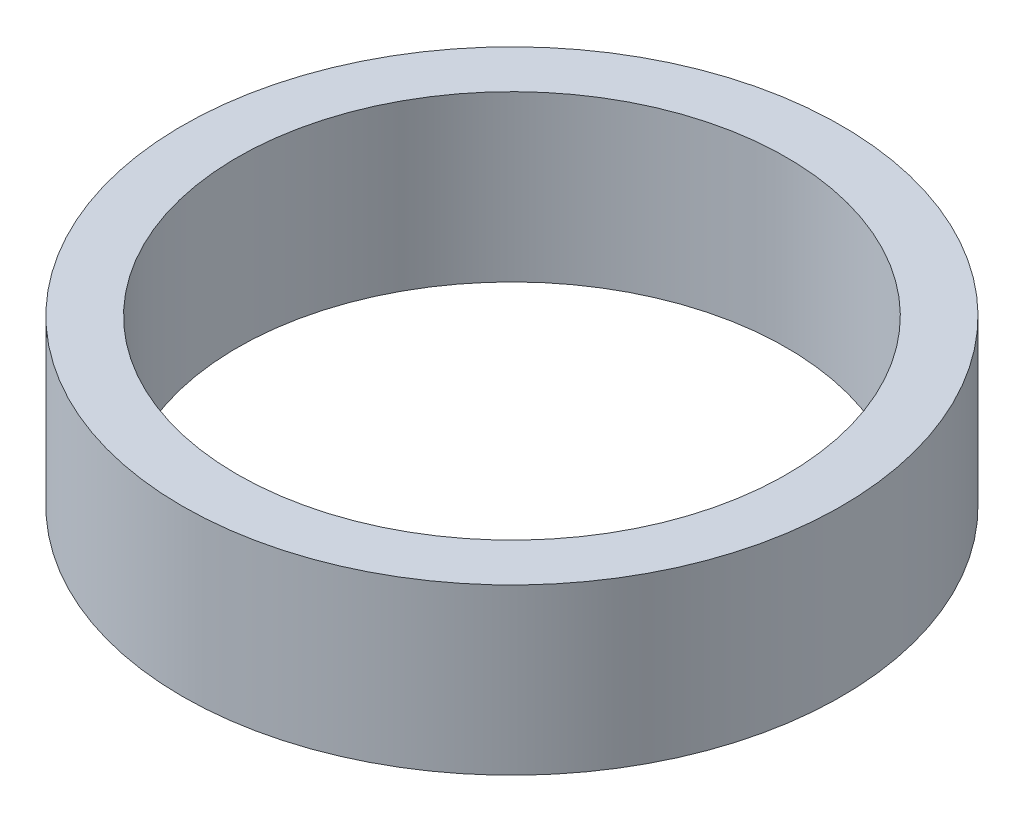
ISO-10303-21;
HEADER;
FILE_DESCRIPTION(('STEP AP214'),'2;1');
FILE_NAME('part.step','',(''),(''),'','','');
FILE_SCHEMA(('AUTOMOTIVE_DESIGN { 1 0 10303 214 1 1 1 1 }'));
ENDSEC;
DATA;
#1=APPLICATION_CONTEXT('core data for automotive mechanical design processes');
#2=APPLICATION_PROTOCOL_DEFINITION('international standard','automotive_design',2000,#1);
#3=PRODUCT_CONTEXT('',#1,'mechanical');
#4=PRODUCT('Part','Part','',(#3));
#5=PRODUCT_RELATED_PRODUCT_CATEGORY('part','',(#4));
#6=PRODUCT_DEFINITION_FORMATION('','',#4);
#7=PRODUCT_DEFINITION_CONTEXT('part definition',#1,'design');
#8=PRODUCT_DEFINITION('design','',#6,#7);
#9=PRODUCT_DEFINITION_SHAPE('','',#8);
#10=(LENGTH_UNIT() NAMED_UNIT(*) SI_UNIT(.MILLI.,.METRE.));
#11=(NAMED_UNIT(*) PLANE_ANGLE_UNIT() SI_UNIT($,.RADIAN.));
#12=(NAMED_UNIT(*) SI_UNIT($,.STERADIAN.) SOLID_ANGLE_UNIT());
#13=UNCERTAINTY_MEASURE_WITH_UNIT(LENGTH_MEASURE(1.E-05),#10,'distance_accuracy_value','');
#14=(GEOMETRIC_REPRESENTATION_CONTEXT(3) GLOBAL_UNCERTAINTY_ASSIGNED_CONTEXT((#13)) GLOBAL_UNIT_ASSIGNED_CONTEXT((#10,
#11,#12)) REPRESENTATION_CONTEXT('',''));
#15=CARTESIAN_POINT('',(0.,0.,0.));
#16=DIRECTION('',(0.,0.,1.));
#17=DIRECTION('',(1.,0.,0.));
#18=AXIS2_PLACEMENT_3D('',#15,#16,#17);
#19=CARTESIAN_POINT('',(0.,15.,0.));
#20=DIRECTION('',(0.,1.,0.));
#21=DIRECTION('',(0.,0.,1.));
#22=AXIS2_PLACEMENT_3D('',#19,#20,#21);
#23=PLANE('',#22);
#24=CARTESIAN_POINT('',(0.,15.,0.));
#25=DIRECTION('',(0.,1.,0.));
#26=DIRECTION('',(0.,0.,1.));
#27=AXIS2_PLACEMENT_3D('',#24,#25,#26);
#28=CIRCLE('',#27,30.);
#29=CARTESIAN_POINT('',(0.,15.,30.));
#30=VERTEX_POINT('',#29);
#31=EDGE_CURVE('E10',#30,#30,#28,.T.);
#32=ORIENTED_EDGE('',*,*,#31,.T.);
#33=EDGE_LOOP('',(#32));
#34=FACE_BOUND('',#33,.T.);
#35=CARTESIAN_POINT('',(0.,15.,0.));
#36=DIRECTION('',(0.,1.,0.));
#37=DIRECTION('',(0.,0.,1.));
#38=AXIS2_PLACEMENT_3D('',#35,#36,#37);
#39=CIRCLE('',#38,25.);
#40=CARTESIAN_POINT('',(0.,15.,25.));
#41=VERTEX_POINT('',#40);
#42=EDGE_CURVE('E46',#41,#41,#39,.T.);
#43=ORIENTED_EDGE('',*,*,#42,.F.);
#44=EDGE_LOOP('',(#43));
#45=FACE_BOUND('',#44,.T.);
#46=ADVANCED_FACE('F35',(#34,#45),#23,.T.);
#47=CARTESIAN_POINT('',(0.,0.,0.));
#48=DIRECTION('',(0.,1.,0.));
#49=DIRECTION('',(0.,0.,1.));
#50=AXIS2_PLACEMENT_3D('',#47,#48,#49);
#51=PLANE('',#50);
#52=CARTESIAN_POINT('',(0.,0.,0.));
#53=DIRECTION('',(0.,1.,0.));
#54=DIRECTION('',(0.,0.,1.));
#55=AXIS2_PLACEMENT_3D('',#52,#53,#54);
#56=CIRCLE('',#55,30.);
#57=CARTESIAN_POINT('',(0.,0.,30.));
#58=VERTEX_POINT('',#57);
#59=EDGE_CURVE('E39',#58,#58,#56,.T.);
#60=ORIENTED_EDGE('',*,*,#59,.F.);
#61=EDGE_LOOP('',(#60));
#62=FACE_BOUND('',#61,.T.);
#63=CARTESIAN_POINT('',(0.,0.,0.));
#64=DIRECTION('',(0.,1.,0.));
#65=DIRECTION('',(0.,0.,1.));
#66=AXIS2_PLACEMENT_3D('',#63,#64,#65);
#67=CIRCLE('',#66,25.);
#68=CARTESIAN_POINT('',(0.,0.,25.));
#69=VERTEX_POINT('',#68);
#70=EDGE_CURVE('E48',#69,#69,#67,.T.);
#71=ORIENTED_EDGE('',*,*,#70,.T.);
#72=EDGE_LOOP('',(#71));
#73=FACE_BOUND('',#72,.T.);
#74=ADVANCED_FACE('F58',(#62,#73),#51,.F.);
#75=CARTESIAN_POINT('',(0.,15.,0.));
#76=DIRECTION('',(0.,-1.,0.));
#77=DIRECTION('',(0.,0.,-1.));
#78=AXIS2_PLACEMENT_3D('',#75,#76,#77);
#79=CYLINDRICAL_SURFACE('',#78,30.);
#80=ORIENTED_EDGE('',*,*,#31,.F.);
#81=EDGE_LOOP('',(#80));
#82=FACE_BOUND('',#81,.T.);
#83=ORIENTED_EDGE('',*,*,#59,.T.);
#84=EDGE_LOOP('',(#83));
#85=FACE_BOUND('',#84,.T.);
#86=ADVANCED_FACE('F37',(#82,#85),#79,.T.);
#87=CARTESIAN_POINT('',(0.,15.,0.));
#88=DIRECTION('',(0.,-1.,0.));
#89=DIRECTION('',(0.,0.,-1.));
#90=AXIS2_PLACEMENT_3D('',#87,#88,#89);
#91=CYLINDRICAL_SURFACE('',#90,25.);
#92=ORIENTED_EDGE('',*,*,#42,.T.);
#93=EDGE_LOOP('',(#92));
#94=FACE_BOUND('',#93,.T.);
#95=ORIENTED_EDGE('',*,*,#70,.F.);
#96=EDGE_LOOP('',(#95));
#97=FACE_BOUND('',#96,.T.);
#98=ADVANCED_FACE('F54',(#94,#97),#91,.F.);
#99=CLOSED_SHELL('',(#46,#74,#86,#98));
#100=MANIFOLD_SOLID_BREP('B2',#99);
#101=ADVANCED_BREP_SHAPE_REPRESENTATION('',(#18,#100),#14);
#102=SHAPE_DEFINITION_REPRESENTATION(#9,#101);
ENDSEC;
END-ISO-10303-21;
